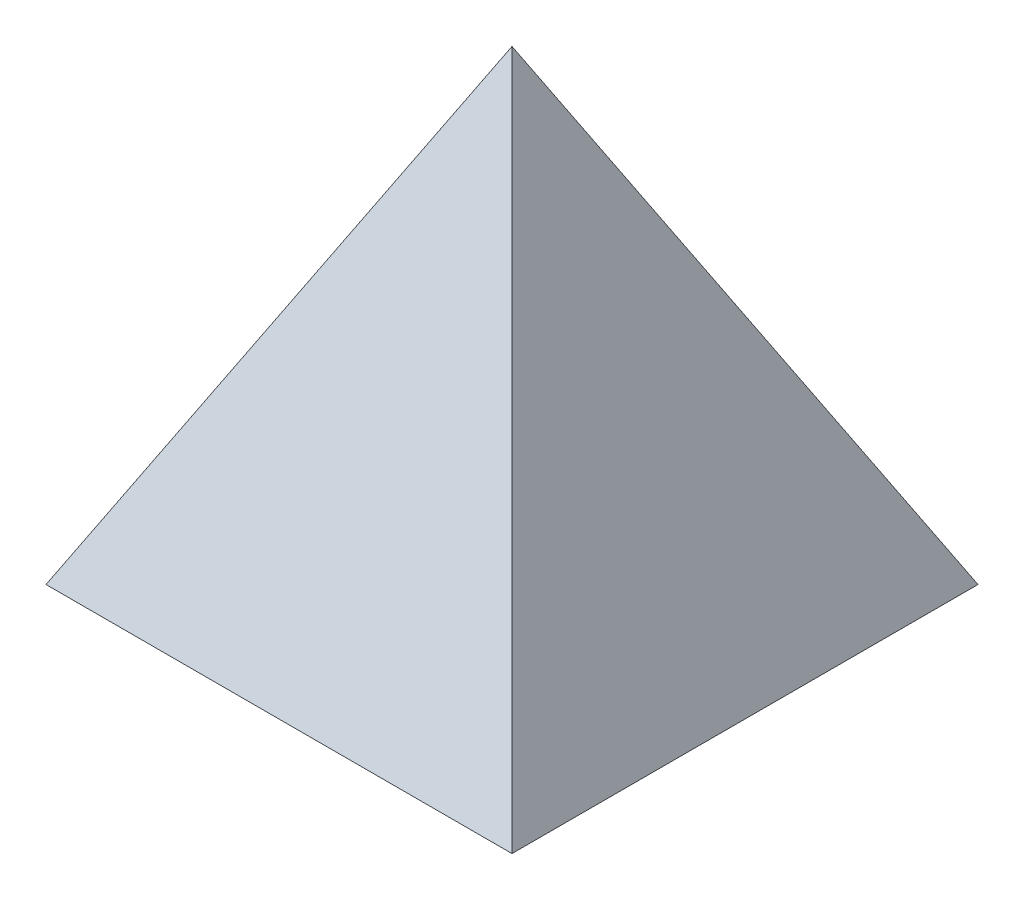
ISO-10303-21;
HEADER;
FILE_DESCRIPTION(('STEP AP214'),'2;1');
FILE_NAME('part.step','',(''),(''),'','','');
FILE_SCHEMA(('AUTOMOTIVE_DESIGN { 1 0 10303 214 1 1 1 1 }'));
ENDSEC;
DATA;
#1=APPLICATION_CONTEXT('core data for automotive mechanical design processes');
#2=APPLICATION_PROTOCOL_DEFINITION('international standard','automotive_design',2000,#1);
#3=PRODUCT_CONTEXT('',#1,'mechanical');
#4=PRODUCT('Part','Part','',(#3));
#5=PRODUCT_RELATED_PRODUCT_CATEGORY('part','',(#4));
#6=PRODUCT_DEFINITION_FORMATION('','',#4);
#7=PRODUCT_DEFINITION_CONTEXT('part definition',#1,'design');
#8=PRODUCT_DEFINITION('design','',#6,#7);
#9=PRODUCT_DEFINITION_SHAPE('','',#8);
#10=(LENGTH_UNIT() NAMED_UNIT(*) SI_UNIT(.MILLI.,.METRE.));
#11=(NAMED_UNIT(*) PLANE_ANGLE_UNIT() SI_UNIT($,.RADIAN.));
#12=(NAMED_UNIT(*) SI_UNIT($,.STERADIAN.) SOLID_ANGLE_UNIT());
#13=UNCERTAINTY_MEASURE_WITH_UNIT(LENGTH_MEASURE(1.E-05),#10,'distance_accuracy_value','');
#14=(GEOMETRIC_REPRESENTATION_CONTEXT(3) GLOBAL_UNCERTAINTY_ASSIGNED_CONTEXT((#13)) GLOBAL_UNIT_ASSIGNED_CONTEXT((#10,
#11,#12)) REPRESENTATION_CONTEXT('',''));
#15=CARTESIAN_POINT('',(0.,0.,0.));
#16=DIRECTION('',(0.,0.,1.));
#17=DIRECTION('',(1.,0.,0.));
#18=AXIS2_PLACEMENT_3D('',#15,#16,#17);
#19=CARTESIAN_POINT('',(-25.,50.,0.));
#20=DIRECTION('',(0.,0.447213595499958,-0.894427190999916));
#21=DIRECTION('',(0.,0.894427190999916,0.447213595499958));
#22=AXIS2_PLACEMENT_3D('',#19,#20,#21);
#23=PLANE('',#22);
#24=DIRECTION('',(-1.,0.,0.));
#25=VECTOR('',#24,1.);
#26=CARTESIAN_POINT('',(-25.,0.,-25.));
#27=LINE('',#26,#25);
#28=CARTESIAN_POINT('',(25.,0.,-25.));
#29=VERTEX_POINT('',#28);
#30=CARTESIAN_POINT('',(-25.,0.,-25.));
#31=VERTEX_POINT('',#30);
#32=EDGE_CURVE('E94',#29,#31,#27,.T.);
#33=ORIENTED_EDGE('',*,*,#32,.T.);
#34=DIRECTION('',(0.408248290463863,0.816496580927726,0.408248290463863));
#35=VECTOR('',#34,1.);
#36=CARTESIAN_POINT('',(-4.16666666666667,41.6666666666667,-4.16666666666667));
#37=LINE('',#36,#35);
#38=CARTESIAN_POINT('',(0.,50.,0.));
#39=VERTEX_POINT('',#38);
#40=EDGE_CURVE('E12',#31,#39,#37,.T.);
#41=ORIENTED_EDGE('',*,*,#40,.T.);
#42=DIRECTION('',(0.408248290463863,-0.816496580927726,-0.408248290463863));
#43=VECTOR('',#42,1.);
#44=CARTESIAN_POINT('',(-4.16666666666667,58.3333333333333,4.16666666666667));
#45=LINE('',#44,#43);
#46=EDGE_CURVE('E56',#39,#29,#45,.T.);
#47=ORIENTED_EDGE('',*,*,#46,.T.);
#48=EDGE_LOOP('',(#33,#41,#47));
#49=FACE_BOUND('',#48,.T.);
#50=ADVANCED_FACE('F47',(#49),#23,.T.);
#51=CARTESIAN_POINT('',(0.,0.,0.));
#52=DIRECTION('',(0.,-1.,0.));
#53=DIRECTION('',(0.,0.,-1.));
#54=AXIS2_PLACEMENT_3D('',#51,#52,#53);
#55=PLANE('',#54);
#56=DIRECTION('',(1.,0.,0.));
#57=VECTOR('',#56,1.);
#58=CARTESIAN_POINT('',(-25.,0.,25.));
#59=LINE('',#58,#57);
#60=CARTESIAN_POINT('',(-25.,0.,25.));
#61=VERTEX_POINT('',#60);
#62=CARTESIAN_POINT('',(25.,0.,25.));
#63=VERTEX_POINT('',#62);
#64=EDGE_CURVE('E86',#61,#63,#59,.T.);
#65=ORIENTED_EDGE('',*,*,#64,.F.);
#66=DIRECTION('',(0.,0.,1.));
#67=VECTOR('',#66,1.);
#68=CARTESIAN_POINT('',(-25.,0.,25.));
#69=LINE('',#68,#67);
#70=EDGE_CURVE('E91',#31,#61,#69,.T.);
#71=ORIENTED_EDGE('',*,*,#70,.F.);
#72=ORIENTED_EDGE('',*,*,#32,.F.);
#73=DIRECTION('',(0.,0.,-1.));
#74=VECTOR('',#73,1.);
#75=CARTESIAN_POINT('',(25.,0.,25.));
#76=LINE('',#75,#74);
#77=EDGE_CURVE('E63',#63,#29,#76,.T.);
#78=ORIENTED_EDGE('',*,*,#77,.F.);
#79=EDGE_LOOP('',(#65,#71,#72,#78));
#80=FACE_BOUND('',#79,.T.);
#81=ADVANCED_FACE('F49',(#80),#55,.T.);
#82=CARTESIAN_POINT('',(-25.,0.,25.));
#83=DIRECTION('',(0.,0.447213595499958,0.894427190999916));
#84=DIRECTION('',(0.,-0.894427190999916,0.447213595499958));
#85=AXIS2_PLACEMENT_3D('',#82,#83,#84);
#86=PLANE('',#85);
#87=DIRECTION('',(0.408248290463863,-0.816496580927726,0.408248290463863));
#88=VECTOR('',#87,1.);
#89=CARTESIAN_POINT('',(16.6666666666667,16.6666666666667,16.6666666666667));
#90=LINE('',#89,#88);
#91=EDGE_CURVE('E77',#39,#63,#90,.T.);
#92=ORIENTED_EDGE('',*,*,#91,.F.);
#93=DIRECTION('',(0.408248290463863,0.816496580927726,-0.408248290463863));
#94=VECTOR('',#93,1.);
#95=CARTESIAN_POINT('',(-25.,0.,25.));
#96=LINE('',#95,#94);
#97=EDGE_CURVE('E83',#61,#39,#96,.T.);
#98=ORIENTED_EDGE('',*,*,#97,.F.);
#99=ORIENTED_EDGE('',*,*,#64,.T.);
#100=EDGE_LOOP('',(#92,#98,#99));
#101=FACE_BOUND('',#100,.T.);
#102=ADVANCED_FACE('F87',(#101),#86,.T.);
#103=CARTESIAN_POINT('',(0.,50.,-25.));
#104=DIRECTION('',(0.894427190999916,0.447213595499958,0.));
#105=DIRECTION('',(-0.447213595499958,0.894427190999916,0.));
#106=AXIS2_PLACEMENT_3D('',#103,#104,#105);
#107=PLANE('',#106);
#108=ORIENTED_EDGE('',*,*,#46,.F.);
#109=ORIENTED_EDGE('',*,*,#91,.T.);
#110=ORIENTED_EDGE('',*,*,#77,.T.);
#111=EDGE_LOOP('',(#108,#109,#110));
#112=FACE_BOUND('',#111,.T.);
#113=ADVANCED_FACE('F79',(#112),#107,.T.);
#114=CARTESIAN_POINT('',(-25.,0.,-25.));
#115=DIRECTION('',(-0.894427190999916,0.447213595499958,0.));
#116=DIRECTION('',(-0.447213595499958,-0.894427190999916,0.));
#117=AXIS2_PLACEMENT_3D('',#114,#115,#116);
#118=PLANE('',#117);
#119=ORIENTED_EDGE('',*,*,#70,.T.);
#120=ORIENTED_EDGE('',*,*,#97,.T.);
#121=ORIENTED_EDGE('',*,*,#40,.F.);
#122=EDGE_LOOP('',(#119,#120,#121));
#123=FACE_BOUND('',#122,.T.);
#124=ADVANCED_FACE('F104',(#123),#118,.T.);
#125=CLOSED_SHELL('',(#50,#81,#102,#113,#124));
#126=MANIFOLD_SOLID_BREP('B2',#125);
#127=ADVANCED_BREP_SHAPE_REPRESENTATION('',(#18,#126),#14);
#128=SHAPE_DEFINITION_REPRESENTATION(#9,#127);
ENDSEC;
END-ISO-10303-21;
